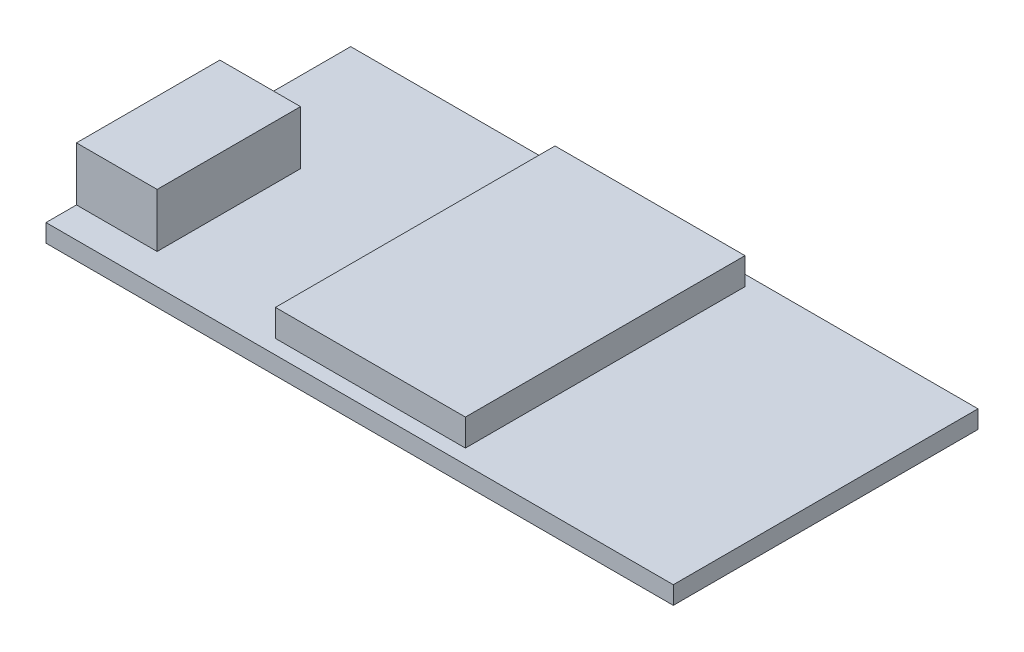
ISO-10303-21;
HEADER;
FILE_DESCRIPTION(('STEP AP214'),'2;1');
FILE_NAME('part.step','',(''),(''),'','','');
FILE_SCHEMA(('AUTOMOTIVE_DESIGN { 1 0 10303 214 1 1 1 1 }'));
ENDSEC;
DATA;
#1=APPLICATION_CONTEXT('core data for automotive mechanical design processes');
#2=APPLICATION_PROTOCOL_DEFINITION('international standard','automotive_design',2000,#1);
#3=PRODUCT_CONTEXT('',#1,'mechanical');
#4=PRODUCT('Part','Part','',(#3));
#5=PRODUCT_RELATED_PRODUCT_CATEGORY('part','',(#4));
#6=PRODUCT_DEFINITION_FORMATION('','',#4);
#7=PRODUCT_DEFINITION_CONTEXT('part definition',#1,'design');
#8=PRODUCT_DEFINITION('design','',#6,#7);
#9=PRODUCT_DEFINITION_SHAPE('','',#8);
#10=(LENGTH_UNIT() NAMED_UNIT(*) SI_UNIT(.MILLI.,.METRE.));
#11=(NAMED_UNIT(*) PLANE_ANGLE_UNIT() SI_UNIT($,.RADIAN.));
#12=(NAMED_UNIT(*) SI_UNIT($,.STERADIAN.) SOLID_ANGLE_UNIT());
#13=UNCERTAINTY_MEASURE_WITH_UNIT(LENGTH_MEASURE(1.E-05),#10,'distance_accuracy_value','');
#14=(GEOMETRIC_REPRESENTATION_CONTEXT(3) GLOBAL_UNCERTAINTY_ASSIGNED_CONTEXT((#13)) GLOBAL_UNIT_ASSIGNED_CONTEXT((#10,
#11,#12)) REPRESENTATION_CONTEXT('',''));
#15=CARTESIAN_POINT('',(0.,0.,0.));
#16=DIRECTION('',(0.,0.,1.));
#17=DIRECTION('',(1.,0.,0.));
#18=AXIS2_PLACEMENT_3D('',#15,#16,#17);
#19=CARTESIAN_POINT('',(0.,0.5,0.));
#20=DIRECTION('',(0.,-1.,0.));
#21=DIRECTION('',(0.,0.,-1.));
#22=AXIS2_PLACEMENT_3D('',#19,#20,#21);
#23=PLANE('',#22);
#24=DIRECTION('',(-1.,0.,0.));
#25=VECTOR('',#24,1.);
#26=CARTESIAN_POINT('',(-17.5,0.5,-1.2));
#27=LINE('',#26,#25);
#28=CARTESIAN_POINT('',(-13.,0.5,-1.2));
#29=VERTEX_POINT('',#28);
#30=CARTESIAN_POINT('',(-17.5,0.5,-1.2));
#31=VERTEX_POINT('',#30);
#32=EDGE_CURVE('E169',#29,#31,#27,.T.);
#33=ORIENTED_EDGE('',*,*,#32,.F.);
#34=DIRECTION('',(0.,0.,-1.));
#35=VECTOR('',#34,1.);
#36=CARTESIAN_POINT('',(-13.,0.5,6.8));
#37=LINE('',#36,#35);
#38=CARTESIAN_POINT('',(-13.,0.5,6.8));
#39=VERTEX_POINT('',#38);
#40=EDGE_CURVE('E158',#39,#29,#37,.T.);
#41=ORIENTED_EDGE('',*,*,#40,.F.);
#42=DIRECTION('',(1.,0.,0.));
#43=VECTOR('',#42,1.);
#44=CARTESIAN_POINT('',(-17.5,0.5,6.8));
#45=LINE('',#44,#43);
#46=CARTESIAN_POINT('',(-17.5,0.5,6.8));
#47=VERTEX_POINT('',#46);
#48=EDGE_CURVE('E153',#47,#39,#45,.T.);
#49=ORIENTED_EDGE('',*,*,#48,.F.);
#50=DIRECTION('',(0.,0.,1.));
#51=VECTOR('',#50,1.);
#52=CARTESIAN_POINT('',(-17.5,0.5,8.5));
#53=LINE('',#52,#51);
#54=CARTESIAN_POINT('',(-17.5,0.5,8.5));
#55=VERTEX_POINT('',#54);
#56=EDGE_CURVE('E209',#47,#55,#53,.T.);
#57=ORIENTED_EDGE('',*,*,#56,.T.);
#58=DIRECTION('',(1.,0.,0.));
#59=VECTOR('',#58,1.);
#60=CARTESIAN_POINT('',(-17.5,0.5,8.5));
#61=LINE('',#60,#59);
#62=CARTESIAN_POINT('',(17.5,0.5,8.5));
#63=VERTEX_POINT('',#62);
#64=EDGE_CURVE('E213',#55,#63,#61,.T.);
#65=ORIENTED_EDGE('',*,*,#64,.T.);
#66=DIRECTION('',(0.,0.,-1.));
#67=VECTOR('',#66,1.);
#68=CARTESIAN_POINT('',(17.5,0.5,8.5));
#69=LINE('',#68,#67);
#70=CARTESIAN_POINT('',(17.5,0.5,-8.5));
#71=VERTEX_POINT('',#70);
#72=EDGE_CURVE('E201',#63,#71,#69,.T.);
#73=ORIENTED_EDGE('',*,*,#72,.T.);
#74=DIRECTION('',(-1.,0.,0.));
#75=VECTOR('',#74,1.);
#76=CARTESIAN_POINT('',(-17.5,0.5,-8.5));
#77=LINE('',#76,#75);
#78=CARTESIAN_POINT('',(-17.5,0.5,-8.5));
#79=VERTEX_POINT('',#78);
#80=EDGE_CURVE('E205',#71,#79,#77,.T.);
#81=ORIENTED_EDGE('',*,*,#80,.T.);
#82=EDGE_CURVE('E210',#79,#31,#53,.T.);
#83=ORIENTED_EDGE('',*,*,#82,.T.);
#84=EDGE_LOOP('',(#33,#41,#49,#57,#65,#73,#81,#83));
#85=FACE_BOUND('',#84,.T.);
#86=DIRECTION('',(0.,0.,1.));
#87=VECTOR('',#86,1.);
#88=CARTESIAN_POINT('',(-5.5,0.5,7.7));
#89=LINE('',#88,#87);
#90=CARTESIAN_POINT('',(-5.5,0.5,-7.9));
#91=VERTEX_POINT('',#90);
#92=CARTESIAN_POINT('',(-5.5,0.5,7.7));
#93=VERTEX_POINT('',#92);
#94=EDGE_CURVE('E151',#91,#93,#89,.T.);
#95=ORIENTED_EDGE('',*,*,#94,.F.);
#96=DIRECTION('',(-1.,0.,0.));
#97=VECTOR('',#96,1.);
#98=CARTESIAN_POINT('',(-5.5,0.5,-7.9));
#99=LINE('',#98,#97);
#100=CARTESIAN_POINT('',(5.1,0.5,-7.9));
#101=VERTEX_POINT('',#100);
#102=EDGE_CURVE('E148',#101,#91,#99,.T.);
#103=ORIENTED_EDGE('',*,*,#102,.F.);
#104=DIRECTION('',(0.,0.,-1.));
#105=VECTOR('',#104,1.);
#106=CARTESIAN_POINT('',(5.1,0.5,7.7));
#107=LINE('',#106,#105);
#108=CARTESIAN_POINT('',(5.1,0.5,7.7));
#109=VERTEX_POINT('',#108);
#110=EDGE_CURVE('E60',#109,#101,#107,.T.);
#111=ORIENTED_EDGE('',*,*,#110,.F.);
#112=DIRECTION('',(1.,0.,0.));
#113=VECTOR('',#112,1.);
#114=CARTESIAN_POINT('',(-5.5,0.5,7.7));
#115=LINE('',#114,#113);
#116=EDGE_CURVE('E55',#93,#109,#115,.T.);
#117=ORIENTED_EDGE('',*,*,#116,.F.);
#118=EDGE_LOOP('',(#95,#103,#111,#117));
#119=FACE_BOUND('',#118,.T.);
#120=ADVANCED_FACE('F39',(#85,#119),#23,.F.);
#121=CARTESIAN_POINT('',(17.5,0.5,8.5));
#122=DIRECTION('',(-1.,0.,0.));
#123=DIRECTION('',(0.,0.,1.));
#124=AXIS2_PLACEMENT_3D('',#121,#122,#123);
#125=PLANE('',#124);
#126=DIRECTION('',(0.,0.,-1.));
#127=VECTOR('',#126,1.);
#128=CARTESIAN_POINT('',(17.5,-0.5,8.5));
#129=LINE('',#128,#127);
#130=CARTESIAN_POINT('',(17.5,-0.5,8.5));
#131=VERTEX_POINT('',#130);
#132=CARTESIAN_POINT('',(17.5,-0.5,-8.5));
#133=VERTEX_POINT('',#132);
#134=EDGE_CURVE('E200',#131,#133,#129,.T.);
#135=ORIENTED_EDGE('',*,*,#134,.T.);
#136=DIRECTION('',(0.,-1.,0.));
#137=VECTOR('',#136,1.);
#138=CARTESIAN_POINT('',(17.5,0.5,-8.5));
#139=LINE('',#138,#137);
#140=EDGE_CURVE('E11',#71,#133,#139,.T.);
#141=ORIENTED_EDGE('',*,*,#140,.F.);
#142=ORIENTED_EDGE('',*,*,#72,.F.);
#143=DIRECTION('',(0.,-1.,0.));
#144=VECTOR('',#143,1.);
#145=CARTESIAN_POINT('',(17.5,0.5,8.5));
#146=LINE('',#145,#144);
#147=EDGE_CURVE('E216',#63,#131,#146,.T.);
#148=ORIENTED_EDGE('',*,*,#147,.T.);
#149=EDGE_LOOP('',(#135,#141,#142,#148));
#150=FACE_BOUND('',#149,.T.);
#151=ADVANCED_FACE('F41',(#150),#125,.F.);
#152=CARTESIAN_POINT('',(-17.5,0.5,-8.5));
#153=DIRECTION('',(0.,0.,1.));
#154=DIRECTION('',(1.,0.,0.));
#155=AXIS2_PLACEMENT_3D('',#152,#153,#154);
#156=PLANE('',#155);
#157=DIRECTION('',(-1.,0.,0.));
#158=VECTOR('',#157,1.);
#159=CARTESIAN_POINT('',(-17.5,-0.5,-8.5));
#160=LINE('',#159,#158);
#161=CARTESIAN_POINT('',(-17.5,-0.5,-8.5));
#162=VERTEX_POINT('',#161);
#163=EDGE_CURVE('E220',#133,#162,#160,.T.);
#164=ORIENTED_EDGE('',*,*,#163,.T.);
#165=DIRECTION('',(0.,-1.,0.));
#166=VECTOR('',#165,1.);
#167=CARTESIAN_POINT('',(-17.5,0.5,-8.5));
#168=LINE('',#167,#166);
#169=EDGE_CURVE('E48',#79,#162,#168,.T.);
#170=ORIENTED_EDGE('',*,*,#169,.F.);
#171=ORIENTED_EDGE('',*,*,#80,.F.);
#172=ORIENTED_EDGE('',*,*,#140,.T.);
#173=EDGE_LOOP('',(#164,#170,#171,#172));
#174=FACE_BOUND('',#173,.T.);
#175=ADVANCED_FACE('F285',(#174),#156,.F.);
#176=CARTESIAN_POINT('',(-17.5,0.5,8.5));
#177=DIRECTION('',(1.,0.,0.));
#178=DIRECTION('',(0.,0.,-1.));
#179=AXIS2_PLACEMENT_3D('',#176,#177,#178);
#180=PLANE('',#179);
#181=DIRECTION('',(0.,0.,1.));
#182=VECTOR('',#181,1.);
#183=CARTESIAN_POINT('',(-17.5,-0.5,8.5));
#184=LINE('',#183,#182);
#185=CARTESIAN_POINT('',(-17.5,-0.5,8.5));
#186=VERTEX_POINT('',#185);
#187=EDGE_CURVE('E223',#162,#186,#184,.T.);
#188=ORIENTED_EDGE('',*,*,#187,.T.);
#189=DIRECTION('',(0.,-1.,0.));
#190=VECTOR('',#189,1.);
#191=CARTESIAN_POINT('',(-17.5,0.5,8.5));
#192=LINE('',#191,#190);
#193=EDGE_CURVE('E231',#55,#186,#192,.T.);
#194=ORIENTED_EDGE('',*,*,#193,.F.);
#195=ORIENTED_EDGE('',*,*,#56,.F.);
#196=DIRECTION('',(0.,-1.,0.));
#197=VECTOR('',#196,1.);
#198=CARTESIAN_POINT('',(-17.5,3.5,6.8));
#199=LINE('',#198,#197);
#200=CARTESIAN_POINT('',(-17.5,3.5,6.8));
#201=VERTEX_POINT('',#200);
#202=EDGE_CURVE('E196',#201,#47,#199,.T.);
#203=ORIENTED_EDGE('',*,*,#202,.F.);
#204=DIRECTION('',(0.,0.,1.));
#205=VECTOR('',#204,1.);
#206=CARTESIAN_POINT('',(-17.5,3.5,6.8));
#207=LINE('',#206,#205);
#208=CARTESIAN_POINT('',(-17.5,3.5,-1.2));
#209=VERTEX_POINT('',#208);
#210=EDGE_CURVE('E164',#209,#201,#207,.T.);
#211=ORIENTED_EDGE('',*,*,#210,.F.);
#212=DIRECTION('',(0.,-1.,0.));
#213=VECTOR('',#212,1.);
#214=CARTESIAN_POINT('',(-17.5,3.5,-1.2));
#215=LINE('',#214,#213);
#216=EDGE_CURVE('E177',#209,#31,#215,.T.);
#217=ORIENTED_EDGE('',*,*,#216,.T.);
#218=ORIENTED_EDGE('',*,*,#82,.F.);
#219=ORIENTED_EDGE('',*,*,#169,.T.);
#220=EDGE_LOOP('',(#188,#194,#195,#203,#211,#217,#218,#219));
#221=FACE_BOUND('',#220,.T.);
#222=ADVANCED_FACE('F240',(#221),#180,.F.);
#223=CARTESIAN_POINT('',(-17.5,0.5,8.5));
#224=DIRECTION('',(0.,0.,-1.));
#225=DIRECTION('',(-1.,0.,0.));
#226=AXIS2_PLACEMENT_3D('',#223,#224,#225);
#227=PLANE('',#226);
#228=DIRECTION('',(1.,0.,0.));
#229=VECTOR('',#228,1.);
#230=CARTESIAN_POINT('',(-17.5,-0.5,8.5));
#231=LINE('',#230,#229);
#232=EDGE_CURVE('E206',#186,#131,#231,.T.);
#233=ORIENTED_EDGE('',*,*,#232,.T.);
#234=ORIENTED_EDGE('',*,*,#147,.F.);
#235=ORIENTED_EDGE('',*,*,#64,.F.);
#236=ORIENTED_EDGE('',*,*,#193,.T.);
#237=EDGE_LOOP('',(#233,#234,#235,#236));
#238=FACE_BOUND('',#237,.T.);
#239=ADVANCED_FACE('F249',(#238),#227,.F.);
#240=CARTESIAN_POINT('',(0.,-0.5,0.));
#241=DIRECTION('',(0.,-1.,0.));
#242=DIRECTION('',(0.,0.,-1.));
#243=AXIS2_PLACEMENT_3D('',#240,#241,#242);
#244=PLANE('',#243);
#245=ORIENTED_EDGE('',*,*,#134,.F.);
#246=ORIENTED_EDGE('',*,*,#232,.F.);
#247=ORIENTED_EDGE('',*,*,#187,.F.);
#248=ORIENTED_EDGE('',*,*,#163,.F.);
#249=EDGE_LOOP('',(#245,#246,#247,#248));
#250=FACE_BOUND('',#249,.T.);
#251=ADVANCED_FACE('F246',(#250),#244,.T.);
#252=CARTESIAN_POINT('',(-17.5,3.5,6.8));
#253=DIRECTION('',(0.,0.,-1.));
#254=DIRECTION('',(-1.,0.,0.));
#255=AXIS2_PLACEMENT_3D('',#252,#253,#254);
#256=PLANE('',#255);
#257=ORIENTED_EDGE('',*,*,#48,.T.);
#258=DIRECTION('',(0.,-1.,0.));
#259=VECTOR('',#258,1.);
#260=CARTESIAN_POINT('',(-13.,3.5,6.8));
#261=LINE('',#260,#259);
#262=CARTESIAN_POINT('',(-13.,3.5,6.8));
#263=VERTEX_POINT('',#262);
#264=EDGE_CURVE('E192',#263,#39,#261,.T.);
#265=ORIENTED_EDGE('',*,*,#264,.F.);
#266=DIRECTION('',(1.,0.,0.));
#267=VECTOR('',#266,1.);
#268=CARTESIAN_POINT('',(-17.5,3.5,6.8));
#269=LINE('',#268,#267);
#270=EDGE_CURVE('E168',#201,#263,#269,.T.);
#271=ORIENTED_EDGE('',*,*,#270,.F.);
#272=ORIENTED_EDGE('',*,*,#202,.T.);
#273=EDGE_LOOP('',(#257,#265,#271,#272));
#274=FACE_BOUND('',#273,.T.);
#275=ADVANCED_FACE('F260',(#274),#256,.F.);
#276=CARTESIAN_POINT('',(-13.,3.5,6.8));
#277=DIRECTION('',(-1.,0.,0.));
#278=DIRECTION('',(0.,0.,1.));
#279=AXIS2_PLACEMENT_3D('',#276,#277,#278);
#280=PLANE('',#279);
#281=ORIENTED_EDGE('',*,*,#40,.T.);
#282=DIRECTION('',(0.,-1.,0.));
#283=VECTOR('',#282,1.);
#284=CARTESIAN_POINT('',(-13.,3.5,-1.2));
#285=LINE('',#284,#283);
#286=CARTESIAN_POINT('',(-13.,3.5,-1.2));
#287=VERTEX_POINT('',#286);
#288=EDGE_CURVE('E188',#287,#29,#285,.T.);
#289=ORIENTED_EDGE('',*,*,#288,.F.);
#290=DIRECTION('',(0.,0.,-1.));
#291=VECTOR('',#290,1.);
#292=CARTESIAN_POINT('',(-13.,3.5,6.8));
#293=LINE('',#292,#291);
#294=EDGE_CURVE('E172',#263,#287,#293,.T.);
#295=ORIENTED_EDGE('',*,*,#294,.F.);
#296=ORIENTED_EDGE('',*,*,#264,.T.);
#297=EDGE_LOOP('',(#281,#289,#295,#296));
#298=FACE_BOUND('',#297,.T.);
#299=ADVANCED_FACE('F271',(#298),#280,.F.);
#300=CARTESIAN_POINT('',(-17.5,3.5,-1.2));
#301=DIRECTION('',(0.,0.,1.));
#302=DIRECTION('',(1.,0.,0.));
#303=AXIS2_PLACEMENT_3D('',#300,#301,#302);
#304=PLANE('',#303);
#305=ORIENTED_EDGE('',*,*,#32,.T.);
#306=ORIENTED_EDGE('',*,*,#216,.F.);
#307=DIRECTION('',(-1.,0.,0.));
#308=VECTOR('',#307,1.);
#309=CARTESIAN_POINT('',(-17.5,3.5,-1.2));
#310=LINE('',#309,#308);
#311=EDGE_CURVE('E175',#287,#209,#310,.T.);
#312=ORIENTED_EDGE('',*,*,#311,.F.);
#313=ORIENTED_EDGE('',*,*,#288,.T.);
#314=EDGE_LOOP('',(#305,#306,#312,#313));
#315=FACE_BOUND('',#314,.T.);
#316=ADVANCED_FACE('F268',(#315),#304,.F.);
#317=CARTESIAN_POINT('',(0.,3.5,0.));
#318=DIRECTION('',(0.,-1.,0.));
#319=DIRECTION('',(0.,0.,-1.));
#320=AXIS2_PLACEMENT_3D('',#317,#318,#319);
#321=PLANE('',#320);
#322=ORIENTED_EDGE('',*,*,#210,.T.);
#323=ORIENTED_EDGE('',*,*,#270,.T.);
#324=ORIENTED_EDGE('',*,*,#294,.T.);
#325=ORIENTED_EDGE('',*,*,#311,.T.);
#326=EDGE_LOOP('',(#322,#323,#324,#325));
#327=FACE_BOUND('',#326,.T.);
#328=ADVANCED_FACE('F264',(#327),#321,.F.);
#329=CARTESIAN_POINT('',(-5.5,2.,7.7));
#330=DIRECTION('',(1.,0.,0.));
#331=DIRECTION('',(0.,0.,-1.));
#332=AXIS2_PLACEMENT_3D('',#329,#330,#331);
#333=PLANE('',#332);
#334=ORIENTED_EDGE('',*,*,#94,.T.);
#335=DIRECTION('',(0.,-1.,0.));
#336=VECTOR('',#335,1.);
#337=CARTESIAN_POINT('',(-5.5,2.,7.7));
#338=LINE('',#337,#336);
#339=CARTESIAN_POINT('',(-5.5,2.,7.7));
#340=VERTEX_POINT('',#339);
#341=EDGE_CURVE('E130',#340,#93,#338,.T.);
#342=ORIENTED_EDGE('',*,*,#341,.F.);
#343=DIRECTION('',(0.,0.,1.));
#344=VECTOR('',#343,1.);
#345=CARTESIAN_POINT('',(-5.5,2.,7.7));
#346=LINE('',#345,#344);
#347=CARTESIAN_POINT('',(-5.5,2.,-7.9));
#348=VERTEX_POINT('',#347);
#349=EDGE_CURVE('E138',#348,#340,#346,.T.);
#350=ORIENTED_EDGE('',*,*,#349,.F.);
#351=DIRECTION('',(0.,-1.,0.));
#352=VECTOR('',#351,1.);
#353=CARTESIAN_POINT('',(-5.5,2.,-7.9));
#354=LINE('',#353,#352);
#355=EDGE_CURVE('E385',#348,#91,#354,.T.);
#356=ORIENTED_EDGE('',*,*,#355,.T.);
#357=EDGE_LOOP('',(#334,#342,#350,#356));
#358=FACE_BOUND('',#357,.T.);
#359=ADVANCED_FACE('F150',(#358),#333,.F.);
#360=CARTESIAN_POINT('',(-5.5,2.,7.7));
#361=DIRECTION('',(0.,0.,-1.));
#362=DIRECTION('',(-1.,0.,0.));
#363=AXIS2_PLACEMENT_3D('',#360,#361,#362);
#364=PLANE('',#363);
#365=ORIENTED_EDGE('',*,*,#116,.T.);
#366=DIRECTION('',(0.,-1.,0.));
#367=VECTOR('',#366,1.);
#368=CARTESIAN_POINT('',(5.1,2.,7.7));
#369=LINE('',#368,#367);
#370=CARTESIAN_POINT('',(5.1,2.,7.7));
#371=VERTEX_POINT('',#370);
#372=EDGE_CURVE('E133',#371,#109,#369,.T.);
#373=ORIENTED_EDGE('',*,*,#372,.F.);
#374=DIRECTION('',(1.,0.,0.));
#375=VECTOR('',#374,1.);
#376=CARTESIAN_POINT('',(-5.5,2.,7.7));
#377=LINE('',#376,#375);
#378=EDGE_CURVE('E126',#340,#371,#377,.T.);
#379=ORIENTED_EDGE('',*,*,#378,.F.);
#380=ORIENTED_EDGE('',*,*,#341,.T.);
#381=EDGE_LOOP('',(#365,#373,#379,#380));
#382=FACE_BOUND('',#381,.T.);
#383=ADVANCED_FACE('F128',(#382),#364,.F.);
#384=CARTESIAN_POINT('',(5.1,2.,7.7));
#385=DIRECTION('',(-1.,0.,0.));
#386=DIRECTION('',(0.,0.,1.));
#387=AXIS2_PLACEMENT_3D('',#384,#385,#386);
#388=PLANE('',#387);
#389=ORIENTED_EDGE('',*,*,#110,.T.);
#390=DIRECTION('',(0.,-1.,0.));
#391=VECTOR('',#390,1.);
#392=CARTESIAN_POINT('',(5.1,2.,-7.9));
#393=LINE('',#392,#391);
#394=CARTESIAN_POINT('',(5.1,2.,-7.9));
#395=VERTEX_POINT('',#394);
#396=EDGE_CURVE('E160',#395,#101,#393,.T.);
#397=ORIENTED_EDGE('',*,*,#396,.F.);
#398=DIRECTION('',(0.,0.,-1.));
#399=VECTOR('',#398,1.);
#400=CARTESIAN_POINT('',(5.1,2.,7.7));
#401=LINE('',#400,#399);
#402=EDGE_CURVE('E137',#371,#395,#401,.T.);
#403=ORIENTED_EDGE('',*,*,#402,.F.);
#404=ORIENTED_EDGE('',*,*,#372,.T.);
#405=EDGE_LOOP('',(#389,#397,#403,#404));
#406=FACE_BOUND('',#405,.T.);
#407=ADVANCED_FACE('F352',(#406),#388,.F.);
#408=CARTESIAN_POINT('',(-5.5,2.,-7.9));
#409=DIRECTION('',(0.,0.,1.));
#410=DIRECTION('',(1.,0.,0.));
#411=AXIS2_PLACEMENT_3D('',#408,#409,#410);
#412=PLANE('',#411);
#413=ORIENTED_EDGE('',*,*,#102,.T.);
#414=ORIENTED_EDGE('',*,*,#355,.F.);
#415=DIRECTION('',(-1.,0.,0.));
#416=VECTOR('',#415,1.);
#417=CARTESIAN_POINT('',(-5.5,2.,-7.9));
#418=LINE('',#417,#416);
#419=EDGE_CURVE('E143',#395,#348,#418,.T.);
#420=ORIENTED_EDGE('',*,*,#419,.F.);
#421=ORIENTED_EDGE('',*,*,#396,.T.);
#422=EDGE_LOOP('',(#413,#414,#420,#421));
#423=FACE_BOUND('',#422,.T.);
#424=ADVANCED_FACE('F361',(#423),#412,.F.);
#425=CARTESIAN_POINT('',(0.,2.,0.));
#426=DIRECTION('',(0.,-1.,0.));
#427=DIRECTION('',(0.,0.,-1.));
#428=AXIS2_PLACEMENT_3D('',#425,#426,#427);
#429=PLANE('',#428);
#430=ORIENTED_EDGE('',*,*,#349,.T.);
#431=ORIENTED_EDGE('',*,*,#378,.T.);
#432=ORIENTED_EDGE('',*,*,#402,.T.);
#433=ORIENTED_EDGE('',*,*,#419,.T.);
#434=EDGE_LOOP('',(#430,#431,#432,#433));
#435=FACE_BOUND('',#434,.T.);
#436=ADVANCED_FACE('F141',(#435),#429,.F.);
#437=CLOSED_SHELL('',(#120,#151,#175,#222,#239,#251,#275,#299,#316,#328,#359,#383,#407,#424,#436));
#438=MANIFOLD_SOLID_BREP('B2',#437);
#439=ADVANCED_BREP_SHAPE_REPRESENTATION('',(#18,#438),#14);
#440=SHAPE_DEFINITION_REPRESENTATION(#9,#439);
ENDSEC;
END-ISO-10303-21;
